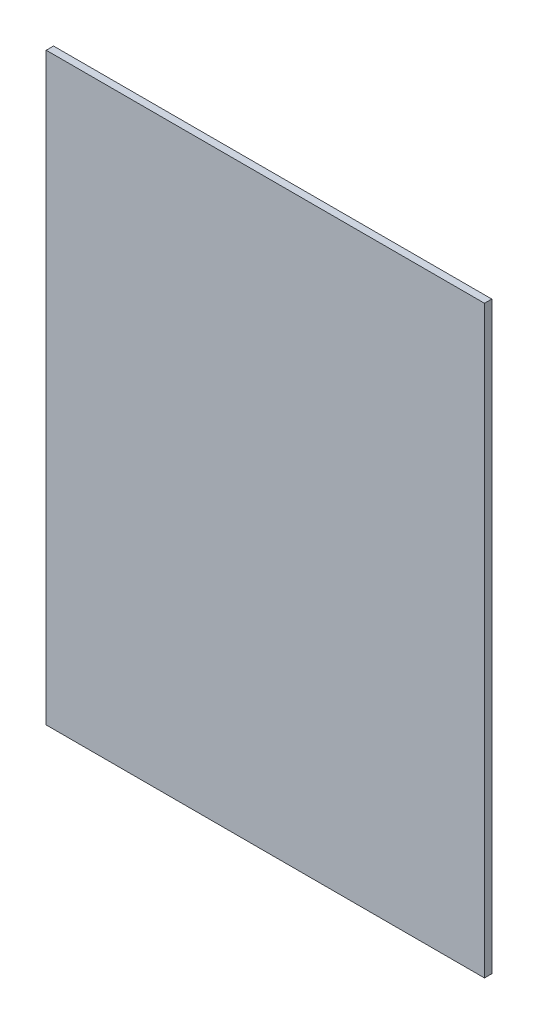
ISO-10303-21;
HEADER;
FILE_DESCRIPTION(('STEP AP214'),'2;1');
FILE_NAME('part.step','',(''),(''),'','','');
FILE_SCHEMA(('AUTOMOTIVE_DESIGN { 1 0 10303 214 1 1 1 1 }'));
ENDSEC;
DATA;
#1=APPLICATION_CONTEXT('core data for automotive mechanical design processes');
#2=APPLICATION_PROTOCOL_DEFINITION('international standard','automotive_design',2000,#1);
#3=PRODUCT_CONTEXT('',#1,'mechanical');
#4=PRODUCT('Part','Part','',(#3));
#5=PRODUCT_RELATED_PRODUCT_CATEGORY('part','',(#4));
#6=PRODUCT_DEFINITION_FORMATION('','',#4);
#7=PRODUCT_DEFINITION_CONTEXT('part definition',#1,'design');
#8=PRODUCT_DEFINITION('design','',#6,#7);
#9=PRODUCT_DEFINITION_SHAPE('','',#8);
#10=(LENGTH_UNIT() NAMED_UNIT(*) SI_UNIT(.MILLI.,.METRE.));
#11=(NAMED_UNIT(*) PLANE_ANGLE_UNIT() SI_UNIT($,.RADIAN.));
#12=(NAMED_UNIT(*) SI_UNIT($,.STERADIAN.) SOLID_ANGLE_UNIT());
#13=UNCERTAINTY_MEASURE_WITH_UNIT(LENGTH_MEASURE(1.E-05),#10,'distance_accuracy_value','');
#14=(GEOMETRIC_REPRESENTATION_CONTEXT(3) GLOBAL_UNCERTAINTY_ASSIGNED_CONTEXT((#13)) GLOBAL_UNIT_ASSIGNED_CONTEXT((#10,
#11,#12)) REPRESENTATION_CONTEXT('',''));
#15=CARTESIAN_POINT('',(0.,0.,0.));
#16=DIRECTION('',(0.,0.,1.));
#17=DIRECTION('',(1.,0.,0.));
#18=AXIS2_PLACEMENT_3D('',#15,#16,#17);
#19=CARTESIAN_POINT('',(0.,0.,2.54));
#20=DIRECTION('',(1.,0.,0.));
#21=DIRECTION('',(0.,0.,-1.));
#22=AXIS2_PLACEMENT_3D('',#19,#20,#21);
#23=PLANE('',#22);
#24=DIRECTION('',(0.,-1.,0.));
#25=VECTOR('',#24,1.);
#26=CARTESIAN_POINT('',(0.,0.,0.));
#27=LINE('',#26,#25);
#28=CARTESIAN_POINT('',(0.,203.2,0.));
#29=VERTEX_POINT('',#28);
#30=CARTESIAN_POINT('',(0.,0.,0.));
#31=VERTEX_POINT('',#30);
#32=EDGE_CURVE('E96',#29,#31,#27,.T.);
#33=ORIENTED_EDGE('',*,*,#32,.T.);
#34=DIRECTION('',(0.,0.,-1.));
#35=VECTOR('',#34,1.);
#36=CARTESIAN_POINT('',(0.,0.,2.54));
#37=LINE('',#36,#35);
#38=CARTESIAN_POINT('',(0.,0.,2.54));
#39=VERTEX_POINT('',#38);
#40=EDGE_CURVE('E11',#39,#31,#37,.T.);
#41=ORIENTED_EDGE('',*,*,#40,.F.);
#42=DIRECTION('',(0.,-1.,0.));
#43=VECTOR('',#42,1.);
#44=CARTESIAN_POINT('',(0.,0.,2.54));
#45=LINE('',#44,#43);
#46=CARTESIAN_POINT('',(0.,203.2,2.54));
#47=VERTEX_POINT('',#46);
#48=EDGE_CURVE('E84',#47,#39,#45,.T.);
#49=ORIENTED_EDGE('',*,*,#48,.F.);
#50=DIRECTION('',(0.,0.,-1.));
#51=VECTOR('',#50,1.);
#52=CARTESIAN_POINT('',(0.,203.2,2.54));
#53=LINE('',#52,#51);
#54=EDGE_CURVE('E92',#47,#29,#53,.T.);
#55=ORIENTED_EDGE('',*,*,#54,.T.);
#56=EDGE_LOOP('',(#33,#41,#49,#55));
#57=FACE_BOUND('',#56,.T.);
#58=ADVANCED_FACE('F33',(#57),#23,.F.);
#59=CARTESIAN_POINT('',(0.,0.,2.54));
#60=DIRECTION('',(0.,1.,0.));
#61=DIRECTION('',(0.,0.,1.));
#62=AXIS2_PLACEMENT_3D('',#59,#60,#61);
#63=PLANE('',#62);
#64=DIRECTION('',(1.,0.,0.));
#65=VECTOR('',#64,1.);
#66=CARTESIAN_POINT('',(0.,0.,0.));
#67=LINE('',#66,#65);
#68=CARTESIAN_POINT('',(152.4,0.,0.));
#69=VERTEX_POINT('',#68);
#70=EDGE_CURVE('E88',#31,#69,#67,.T.);
#71=ORIENTED_EDGE('',*,*,#70,.T.);
#72=DIRECTION('',(0.,0.,-1.));
#73=VECTOR('',#72,1.);
#74=CARTESIAN_POINT('',(152.4,0.,2.54));
#75=LINE('',#74,#73);
#76=CARTESIAN_POINT('',(152.4,0.,2.54));
#77=VERTEX_POINT('',#76);
#78=EDGE_CURVE('E41',#77,#69,#75,.T.);
#79=ORIENTED_EDGE('',*,*,#78,.F.);
#80=DIRECTION('',(1.,0.,0.));
#81=VECTOR('',#80,1.);
#82=CARTESIAN_POINT('',(0.,0.,2.54));
#83=LINE('',#82,#81);
#84=EDGE_CURVE('E79',#39,#77,#83,.T.);
#85=ORIENTED_EDGE('',*,*,#84,.F.);
#86=ORIENTED_EDGE('',*,*,#40,.T.);
#87=EDGE_LOOP('',(#71,#79,#85,#86));
#88=FACE_BOUND('',#87,.T.);
#89=ADVANCED_FACE('F87',(#88),#63,.F.);
#90=CARTESIAN_POINT('',(152.4,0.,2.54));
#91=DIRECTION('',(-1.,0.,0.));
#92=DIRECTION('',(0.,0.,1.));
#93=AXIS2_PLACEMENT_3D('',#90,#91,#92);
#94=PLANE('',#93);
#95=DIRECTION('',(0.,1.,0.));
#96=VECTOR('',#95,1.);
#97=CARTESIAN_POINT('',(152.4,0.,0.));
#98=LINE('',#97,#96);
#99=CARTESIAN_POINT('',(152.4,203.2,0.));
#100=VERTEX_POINT('',#99);
#101=EDGE_CURVE('E66',#69,#100,#98,.T.);
#102=ORIENTED_EDGE('',*,*,#101,.T.);
#103=DIRECTION('',(0.,0.,-1.));
#104=VECTOR('',#103,1.);
#105=CARTESIAN_POINT('',(152.4,203.2,2.54));
#106=LINE('',#105,#104);
#107=CARTESIAN_POINT('',(152.4,203.2,2.54));
#108=VERTEX_POINT('',#107);
#109=EDGE_CURVE('E89',#108,#100,#106,.T.);
#110=ORIENTED_EDGE('',*,*,#109,.F.);
#111=DIRECTION('',(0.,1.,0.));
#112=VECTOR('',#111,1.);
#113=CARTESIAN_POINT('',(152.4,0.,2.54));
#114=LINE('',#113,#112);
#115=EDGE_CURVE('E82',#77,#108,#114,.T.);
#116=ORIENTED_EDGE('',*,*,#115,.F.);
#117=ORIENTED_EDGE('',*,*,#78,.T.);
#118=EDGE_LOOP('',(#102,#110,#116,#117));
#119=FACE_BOUND('',#118,.T.);
#120=ADVANCED_FACE('F90',(#119),#94,.F.);
#121=CARTESIAN_POINT('',(0.,203.2,2.54));
#122=DIRECTION('',(0.,-1.,0.));
#123=DIRECTION('',(0.,0.,-1.));
#124=AXIS2_PLACEMENT_3D('',#121,#122,#123);
#125=PLANE('',#124);
#126=DIRECTION('',(-1.,0.,0.));
#127=VECTOR('',#126,1.);
#128=CARTESIAN_POINT('',(0.,203.2,0.));
#129=LINE('',#128,#127);
#130=EDGE_CURVE('E72',#100,#29,#129,.T.);
#131=ORIENTED_EDGE('',*,*,#130,.T.);
#132=ORIENTED_EDGE('',*,*,#54,.F.);
#133=DIRECTION('',(-1.,0.,0.));
#134=VECTOR('',#133,1.);
#135=CARTESIAN_POINT('',(0.,203.2,2.54));
#136=LINE('',#135,#134);
#137=EDGE_CURVE('E49',#108,#47,#136,.T.);
#138=ORIENTED_EDGE('',*,*,#137,.F.);
#139=ORIENTED_EDGE('',*,*,#109,.T.);
#140=EDGE_LOOP('',(#131,#132,#138,#139));
#141=FACE_BOUND('',#140,.T.);
#142=ADVANCED_FACE('F103',(#141),#125,.F.);
#143=CARTESIAN_POINT('',(0.,0.,2.54));
#144=DIRECTION('',(0.,0.,-1.));
#145=DIRECTION('',(-1.,0.,0.));
#146=AXIS2_PLACEMENT_3D('',#143,#144,#145);
#147=PLANE('',#146);
#148=ORIENTED_EDGE('',*,*,#48,.T.);
#149=ORIENTED_EDGE('',*,*,#84,.T.);
#150=ORIENTED_EDGE('',*,*,#115,.T.);
#151=ORIENTED_EDGE('',*,*,#137,.T.);
#152=EDGE_LOOP('',(#148,#149,#150,#151));
#153=FACE_BOUND('',#152,.T.);
#154=ADVANCED_FACE('F80',(#153),#147,.F.);
#155=CARTESIAN_POINT('',(0.,0.,0.));
#156=DIRECTION('',(0.,0.,-1.));
#157=DIRECTION('',(-1.,0.,0.));
#158=AXIS2_PLACEMENT_3D('',#155,#156,#157);
#159=PLANE('',#158);
#160=ORIENTED_EDGE('',*,*,#32,.F.);
#161=ORIENTED_EDGE('',*,*,#130,.F.);
#162=ORIENTED_EDGE('',*,*,#101,.F.);
#163=ORIENTED_EDGE('',*,*,#70,.F.);
#164=EDGE_LOOP('',(#160,#161,#162,#163));
#165=FACE_BOUND('',#164,.T.);
#166=ADVANCED_FACE('F106',(#165),#159,.T.);
#167=CLOSED_SHELL('',(#58,#89,#120,#142,#154,#166));
#168=MANIFOLD_SOLID_BREP('B2',#167);
#169=ADVANCED_BREP_SHAPE_REPRESENTATION('',(#18,#168),#14);
#170=SHAPE_DEFINITION_REPRESENTATION(#9,#169);
ENDSEC;
END-ISO-10303-21;
